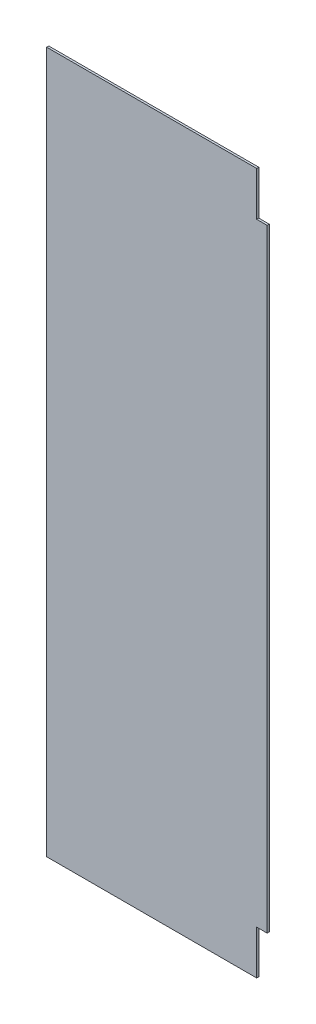
ISO-10303-21;
HEADER;
FILE_DESCRIPTION(('STEP AP214'),'2;1');
FILE_NAME('part.step','',(''),(''),'','','');
FILE_SCHEMA(('AUTOMOTIVE_DESIGN { 1 0 10303 214 1 1 1 1 }'));
ENDSEC;
DATA;
#1=APPLICATION_CONTEXT('core data for automotive mechanical design processes');
#2=APPLICATION_PROTOCOL_DEFINITION('international standard','automotive_design',2000,#1);
#3=PRODUCT_CONTEXT('',#1,'mechanical');
#4=PRODUCT('Part','Part','',(#3));
#5=PRODUCT_RELATED_PRODUCT_CATEGORY('part','',(#4));
#6=PRODUCT_DEFINITION_FORMATION('','',#4);
#7=PRODUCT_DEFINITION_CONTEXT('part definition',#1,'design');
#8=PRODUCT_DEFINITION('design','',#6,#7);
#9=PRODUCT_DEFINITION_SHAPE('','',#8);
#10=(LENGTH_UNIT() NAMED_UNIT(*) SI_UNIT(.MILLI.,.METRE.));
#11=(NAMED_UNIT(*) PLANE_ANGLE_UNIT() SI_UNIT($,.RADIAN.));
#12=(NAMED_UNIT(*) SI_UNIT($,.STERADIAN.) SOLID_ANGLE_UNIT());
#13=UNCERTAINTY_MEASURE_WITH_UNIT(LENGTH_MEASURE(1.E-05),#10,'distance_accuracy_value','');
#14=(GEOMETRIC_REPRESENTATION_CONTEXT(3) GLOBAL_UNCERTAINTY_ASSIGNED_CONTEXT((#13)) GLOBAL_UNIT_ASSIGNED_CONTEXT((#10,
#11,#12)) REPRESENTATION_CONTEXT('',''));
#15=CARTESIAN_POINT('',(0.,0.,0.));
#16=DIRECTION('',(0.,0.,1.));
#17=DIRECTION('',(1.,0.,0.));
#18=AXIS2_PLACEMENT_3D('',#15,#16,#17);
#19=CARTESIAN_POINT('',(23.4,14.6,0.1));
#20=DIRECTION('',(-1.,0.,0.));
#21=DIRECTION('',(0.,0.,1.));
#22=AXIS2_PLACEMENT_3D('',#19,#20,#21);
#23=PLANE('',#22);
#24=DIRECTION('',(0.,1.,0.));
#25=VECTOR('',#24,1.);
#26=CARTESIAN_POINT('',(23.4,14.6,0.));
#27=LINE('',#26,#25);
#28=CARTESIAN_POINT('',(23.4,14.6,0.));
#29=VERTEX_POINT('',#28);
#30=CARTESIAN_POINT('',(23.4,16.7,0.));
#31=VERTEX_POINT('',#30);
#32=EDGE_CURVE('E129',#29,#31,#27,.T.);
#33=ORIENTED_EDGE('',*,*,#32,.T.);
#34=DIRECTION('',(0.,0.,-1.));
#35=VECTOR('',#34,1.);
#36=CARTESIAN_POINT('',(23.4,16.7,0.1));
#37=LINE('',#36,#35);
#38=CARTESIAN_POINT('',(23.4,16.7,0.1));
#39=VERTEX_POINT('',#38);
#40=EDGE_CURVE('E11',#39,#31,#37,.T.);
#41=ORIENTED_EDGE('',*,*,#40,.F.);
#42=DIRECTION('',(0.,1.,0.));
#43=VECTOR('',#42,1.);
#44=CARTESIAN_POINT('',(23.4,14.6,0.1));
#45=LINE('',#44,#43);
#46=CARTESIAN_POINT('',(23.4,14.6,0.1));
#47=VERTEX_POINT('',#46);
#48=EDGE_CURVE('E143',#47,#39,#45,.T.);
#49=ORIENTED_EDGE('',*,*,#48,.F.);
#50=DIRECTION('',(0.,0.,-1.));
#51=VECTOR('',#50,1.);
#52=CARTESIAN_POINT('',(23.4,14.6,0.1));
#53=LINE('',#52,#51);
#54=EDGE_CURVE('E125',#47,#29,#53,.T.);
#55=ORIENTED_EDGE('',*,*,#54,.T.);
#56=EDGE_LOOP('',(#33,#41,#49,#55));
#57=FACE_BOUND('',#56,.T.);
#58=ADVANCED_FACE('F33',(#57),#23,.F.);
#59=CARTESIAN_POINT('',(13.4,16.7,0.1));
#60=DIRECTION('',(0.,-1.,0.));
#61=DIRECTION('',(0.,0.,-1.));
#62=AXIS2_PLACEMENT_3D('',#59,#60,#61);
#63=PLANE('',#62);
#64=DIRECTION('',(-1.,0.,0.));
#65=VECTOR('',#64,1.);
#66=CARTESIAN_POINT('',(13.4,16.7,0.));
#67=LINE('',#66,#65);
#68=CARTESIAN_POINT('',(13.4,16.7,0.));
#69=VERTEX_POINT('',#68);
#70=EDGE_CURVE('E132',#31,#69,#67,.T.);
#71=ORIENTED_EDGE('',*,*,#70,.T.);
#72=DIRECTION('',(0.,0.,-1.));
#73=VECTOR('',#72,1.);
#74=CARTESIAN_POINT('',(13.4,16.7,0.1));
#75=LINE('',#74,#73);
#76=CARTESIAN_POINT('',(13.4,16.7,0.1));
#77=VERTEX_POINT('',#76);
#78=EDGE_CURVE('E41',#77,#69,#75,.T.);
#79=ORIENTED_EDGE('',*,*,#78,.F.);
#80=DIRECTION('',(-1.,0.,0.));
#81=VECTOR('',#80,1.);
#82=CARTESIAN_POINT('',(13.4,16.7,0.1));
#83=LINE('',#82,#81);
#84=EDGE_CURVE('E92',#39,#77,#83,.T.);
#85=ORIENTED_EDGE('',*,*,#84,.F.);
#86=ORIENTED_EDGE('',*,*,#40,.T.);
#87=EDGE_LOOP('',(#71,#79,#85,#86));
#88=FACE_BOUND('',#87,.T.);
#89=ADVANCED_FACE('F178',(#88),#63,.F.);
#90=CARTESIAN_POINT('',(13.4,-16.7,0.1));
#91=DIRECTION('',(1.,0.,0.));
#92=DIRECTION('',(0.,0.,-1.));
#93=AXIS2_PLACEMENT_3D('',#90,#91,#92);
#94=PLANE('',#93);
#95=DIRECTION('',(0.,-1.,0.));
#96=VECTOR('',#95,1.);
#97=CARTESIAN_POINT('',(13.4,-16.7,0.));
#98=LINE('',#97,#96);
#99=CARTESIAN_POINT('',(13.4,-16.7,0.));
#100=VERTEX_POINT('',#99);
#101=EDGE_CURVE('E134',#69,#100,#98,.T.);
#102=ORIENTED_EDGE('',*,*,#101,.T.);
#103=DIRECTION('',(0.,0.,-1.));
#104=VECTOR('',#103,1.);
#105=CARTESIAN_POINT('',(13.4,-16.7,0.1));
#106=LINE('',#105,#104);
#107=CARTESIAN_POINT('',(13.4,-16.7,0.1));
#108=VERTEX_POINT('',#107);
#109=EDGE_CURVE('E150',#108,#100,#106,.T.);
#110=ORIENTED_EDGE('',*,*,#109,.F.);
#111=DIRECTION('',(0.,-1.,0.));
#112=VECTOR('',#111,1.);
#113=CARTESIAN_POINT('',(13.4,-16.7,0.1));
#114=LINE('',#113,#112);
#115=EDGE_CURVE('E158',#77,#108,#114,.T.);
#116=ORIENTED_EDGE('',*,*,#115,.F.);
#117=ORIENTED_EDGE('',*,*,#78,.T.);
#118=EDGE_LOOP('',(#102,#110,#116,#117));
#119=FACE_BOUND('',#118,.T.);
#120=ADVANCED_FACE('F156',(#119),#94,.F.);
#121=CARTESIAN_POINT('',(13.4,-16.7,0.1));
#122=DIRECTION('',(0.,1.,0.));
#123=DIRECTION('',(0.,0.,1.));
#124=AXIS2_PLACEMENT_3D('',#121,#122,#123);
#125=PLANE('',#124);
#126=DIRECTION('',(1.,0.,0.));
#127=VECTOR('',#126,1.);
#128=CARTESIAN_POINT('',(13.4,-16.7,0.));
#129=LINE('',#128,#127);
#130=CARTESIAN_POINT('',(23.4,-16.7,0.));
#131=VERTEX_POINT('',#130);
#132=EDGE_CURVE('E136',#100,#131,#129,.T.);
#133=ORIENTED_EDGE('',*,*,#132,.T.);
#134=DIRECTION('',(0.,0.,-1.));
#135=VECTOR('',#134,1.);
#136=CARTESIAN_POINT('',(23.4,-16.7,0.1));
#137=LINE('',#136,#135);
#138=CARTESIAN_POINT('',(23.4,-16.7,0.1));
#139=VERTEX_POINT('',#138);
#140=EDGE_CURVE('E147',#139,#131,#137,.T.);
#141=ORIENTED_EDGE('',*,*,#140,.F.);
#142=DIRECTION('',(1.,0.,0.));
#143=VECTOR('',#142,1.);
#144=CARTESIAN_POINT('',(13.4,-16.7,0.1));
#145=LINE('',#144,#143);
#146=EDGE_CURVE('E170',#108,#139,#145,.T.);
#147=ORIENTED_EDGE('',*,*,#146,.F.);
#148=ORIENTED_EDGE('',*,*,#109,.T.);
#149=EDGE_LOOP('',(#133,#141,#147,#148));
#150=FACE_BOUND('',#149,.T.);
#151=ADVANCED_FACE('F166',(#150),#125,.F.);
#152=CARTESIAN_POINT('',(23.4,-16.7,0.1));
#153=DIRECTION('',(-1.,0.,0.));
#154=DIRECTION('',(0.,0.,1.));
#155=AXIS2_PLACEMENT_3D('',#152,#153,#154);
#156=PLANE('',#155);
#157=DIRECTION('',(0.,1.,0.));
#158=VECTOR('',#157,1.);
#159=CARTESIAN_POINT('',(23.4,-16.7,0.));
#160=LINE('',#159,#158);
#161=CARTESIAN_POINT('',(23.4,-14.6,0.));
#162=VERTEX_POINT('',#161);
#163=EDGE_CURVE('E138',#131,#162,#160,.T.);
#164=ORIENTED_EDGE('',*,*,#163,.T.);
#165=DIRECTION('',(0.,0.,-1.));
#166=VECTOR('',#165,1.);
#167=CARTESIAN_POINT('',(23.4,-14.6,0.1));
#168=LINE('',#167,#166);
#169=CARTESIAN_POINT('',(23.4,-14.6,0.1));
#170=VERTEX_POINT('',#169);
#171=EDGE_CURVE('E120',#170,#162,#168,.T.);
#172=ORIENTED_EDGE('',*,*,#171,.F.);
#173=DIRECTION('',(0.,1.,0.));
#174=VECTOR('',#173,1.);
#175=CARTESIAN_POINT('',(23.4,-16.7,0.1));
#176=LINE('',#175,#174);
#177=EDGE_CURVE('E111',#139,#170,#176,.T.);
#178=ORIENTED_EDGE('',*,*,#177,.F.);
#179=ORIENTED_EDGE('',*,*,#140,.T.);
#180=EDGE_LOOP('',(#164,#172,#178,#179));
#181=FACE_BOUND('',#180,.T.);
#182=ADVANCED_FACE('F169',(#181),#156,.F.);
#183=CARTESIAN_POINT('',(23.9,-14.6,0.1));
#184=DIRECTION('',(0.,1.,0.));
#185=DIRECTION('',(0.,0.,1.));
#186=AXIS2_PLACEMENT_3D('',#183,#184,#185);
#187=PLANE('',#186);
#188=DIRECTION('',(1.,0.,0.));
#189=VECTOR('',#188,1.);
#190=CARTESIAN_POINT('',(23.9,-14.6,0.));
#191=LINE('',#190,#189);
#192=CARTESIAN_POINT('',(23.9,-14.6,0.));
#193=VERTEX_POINT('',#192);
#194=EDGE_CURVE('E119',#162,#193,#191,.T.);
#195=ORIENTED_EDGE('',*,*,#194,.T.);
#196=DIRECTION('',(0.,0.,-1.));
#197=VECTOR('',#196,1.);
#198=CARTESIAN_POINT('',(23.9,-14.6,0.1));
#199=LINE('',#198,#197);
#200=CARTESIAN_POINT('',(23.9,-14.6,0.1));
#201=VERTEX_POINT('',#200);
#202=EDGE_CURVE('E116',#201,#193,#199,.T.);
#203=ORIENTED_EDGE('',*,*,#202,.F.);
#204=DIRECTION('',(1.,0.,0.));
#205=VECTOR('',#204,1.);
#206=CARTESIAN_POINT('',(23.9,-14.6,0.1));
#207=LINE('',#206,#205);
#208=EDGE_CURVE('E105',#170,#201,#207,.T.);
#209=ORIENTED_EDGE('',*,*,#208,.F.);
#210=ORIENTED_EDGE('',*,*,#171,.T.);
#211=EDGE_LOOP('',(#195,#203,#209,#210));
#212=FACE_BOUND('',#211,.T.);
#213=ADVANCED_FACE('F117',(#212),#187,.F.);
#214=CARTESIAN_POINT('',(23.9,14.6,0.1));
#215=DIRECTION('',(-1.,0.,0.));
#216=DIRECTION('',(0.,0.,1.));
#217=AXIS2_PLACEMENT_3D('',#214,#215,#216);
#218=PLANE('',#217);
#219=DIRECTION('',(0.,1.,0.));
#220=VECTOR('',#219,1.);
#221=CARTESIAN_POINT('',(23.9,14.6,0.));
#222=LINE('',#221,#220);
#223=CARTESIAN_POINT('',(23.9,14.6,0.));
#224=VERTEX_POINT('',#223);
#225=EDGE_CURVE('E78',#193,#224,#222,.T.);
#226=ORIENTED_EDGE('',*,*,#225,.T.);
#227=DIRECTION('',(0.,0.,-1.));
#228=VECTOR('',#227,1.);
#229=CARTESIAN_POINT('',(23.9,14.6,0.1));
#230=LINE('',#229,#228);
#231=CARTESIAN_POINT('',(23.9,14.6,0.1));
#232=VERTEX_POINT('',#231);
#233=EDGE_CURVE('E121',#232,#224,#230,.T.);
#234=ORIENTED_EDGE('',*,*,#233,.F.);
#235=DIRECTION('',(0.,1.,0.));
#236=VECTOR('',#235,1.);
#237=CARTESIAN_POINT('',(23.9,14.6,0.1));
#238=LINE('',#237,#236);
#239=EDGE_CURVE('E109',#201,#232,#238,.T.);
#240=ORIENTED_EDGE('',*,*,#239,.F.);
#241=ORIENTED_EDGE('',*,*,#202,.T.);
#242=EDGE_LOOP('',(#226,#234,#240,#241));
#243=FACE_BOUND('',#242,.T.);
#244=ADVANCED_FACE('F123',(#243),#218,.F.);
#245=CARTESIAN_POINT('',(23.4,14.6,0.1));
#246=DIRECTION('',(0.,-1.,0.));
#247=DIRECTION('',(0.,0.,-1.));
#248=AXIS2_PLACEMENT_3D('',#245,#246,#247);
#249=PLANE('',#248);
#250=DIRECTION('',(-1.,0.,0.));
#251=VECTOR('',#250,1.);
#252=CARTESIAN_POINT('',(23.4,14.6,0.));
#253=LINE('',#252,#251);
#254=EDGE_CURVE('E84',#224,#29,#253,.T.);
#255=ORIENTED_EDGE('',*,*,#254,.T.);
#256=ORIENTED_EDGE('',*,*,#54,.F.);
#257=DIRECTION('',(-1.,0.,0.));
#258=VECTOR('',#257,1.);
#259=CARTESIAN_POINT('',(23.4,14.6,0.1));
#260=LINE('',#259,#258);
#261=EDGE_CURVE('E49',#232,#47,#260,.T.);
#262=ORIENTED_EDGE('',*,*,#261,.F.);
#263=ORIENTED_EDGE('',*,*,#233,.T.);
#264=EDGE_LOOP('',(#255,#256,#262,#263));
#265=FACE_BOUND('',#264,.T.);
#266=ADVANCED_FACE('F194',(#265),#249,.F.);
#267=CARTESIAN_POINT('',(0.,0.,0.1));
#268=DIRECTION('',(0.,0.,-1.));
#269=DIRECTION('',(-1.,0.,0.));
#270=AXIS2_PLACEMENT_3D('',#267,#268,#269);
#271=PLANE('',#270);
#272=ORIENTED_EDGE('',*,*,#48,.T.);
#273=ORIENTED_EDGE('',*,*,#84,.T.);
#274=ORIENTED_EDGE('',*,*,#115,.T.);
#275=ORIENTED_EDGE('',*,*,#146,.T.);
#276=ORIENTED_EDGE('',*,*,#177,.T.);
#277=ORIENTED_EDGE('',*,*,#208,.T.);
#278=ORIENTED_EDGE('',*,*,#239,.T.);
#279=ORIENTED_EDGE('',*,*,#261,.T.);
#280=EDGE_LOOP('',(#272,#273,#274,#275,#276,#277,#278,#279));
#281=FACE_BOUND('',#280,.T.);
#282=ADVANCED_FACE('F107',(#281),#271,.F.);
#283=CARTESIAN_POINT('',(0.,0.,0.));
#284=DIRECTION('',(0.,0.,-1.));
#285=DIRECTION('',(-1.,0.,0.));
#286=AXIS2_PLACEMENT_3D('',#283,#284,#285);
#287=PLANE('',#286);
#288=ORIENTED_EDGE('',*,*,#32,.F.);
#289=ORIENTED_EDGE('',*,*,#254,.F.);
#290=ORIENTED_EDGE('',*,*,#225,.F.);
#291=ORIENTED_EDGE('',*,*,#194,.F.);
#292=ORIENTED_EDGE('',*,*,#163,.F.);
#293=ORIENTED_EDGE('',*,*,#132,.F.);
#294=ORIENTED_EDGE('',*,*,#101,.F.);
#295=ORIENTED_EDGE('',*,*,#70,.F.);
#296=EDGE_LOOP('',(#288,#289,#290,#291,#292,#293,#294,#295));
#297=FACE_BOUND('',#296,.T.);
#298=ADVANCED_FACE('F162',(#297),#287,.T.);
#299=CLOSED_SHELL('',(#58,#89,#120,#151,#182,#213,#244,#266,#282,#298));
#300=MANIFOLD_SOLID_BREP('B2',#299);
#301=ADVANCED_BREP_SHAPE_REPRESENTATION('',(#18,#300),#14);
#302=SHAPE_DEFINITION_REPRESENTATION(#9,#301);
ENDSEC;
END-ISO-10303-21;
